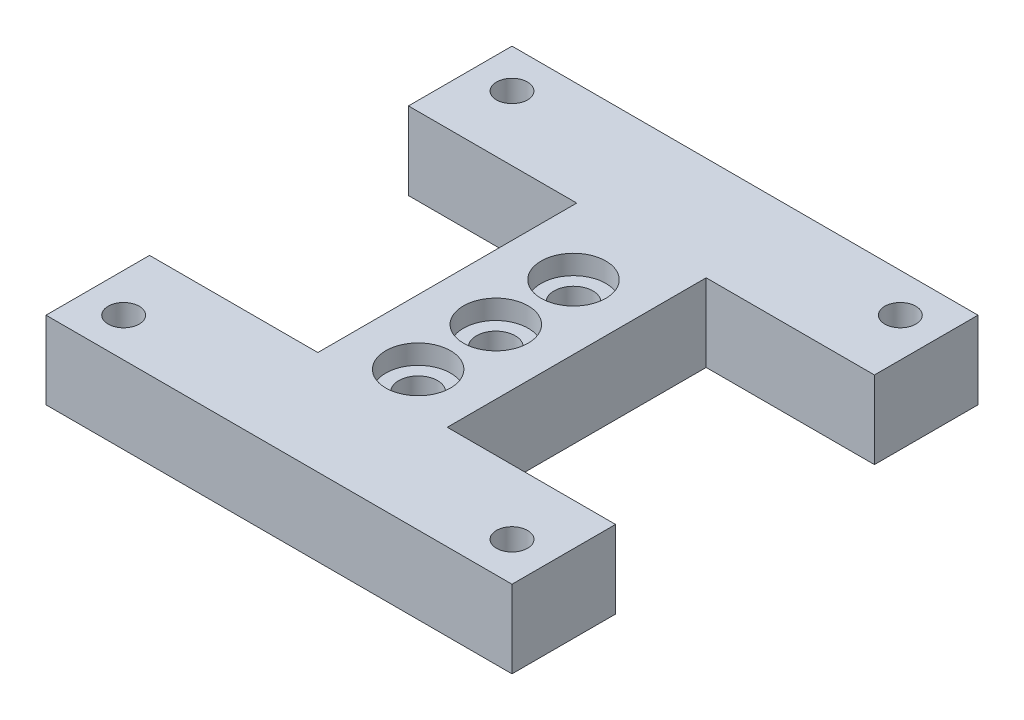
ISO-10303-21;
HEADER;
FILE_DESCRIPTION(('STEP AP214'),'2;1');
FILE_NAME('part.step','',(''),(''),'','','');
FILE_SCHEMA(('AUTOMOTIVE_DESIGN { 1 0 10303 214 1 1 1 1 }'));
ENDSEC;
DATA;
#1=APPLICATION_CONTEXT('core data for automotive mechanical design processes');
#2=APPLICATION_PROTOCOL_DEFINITION('international standard','automotive_design',2000,#1);
#3=PRODUCT_CONTEXT('',#1,'mechanical');
#4=PRODUCT('Part','Part','',(#3));
#5=PRODUCT_RELATED_PRODUCT_CATEGORY('part','',(#4));
#6=PRODUCT_DEFINITION_FORMATION('','',#4);
#7=PRODUCT_DEFINITION_CONTEXT('part definition',#1,'design');
#8=PRODUCT_DEFINITION('design','',#6,#7);
#9=PRODUCT_DEFINITION_SHAPE('','',#8);
#10=(LENGTH_UNIT() NAMED_UNIT(*) SI_UNIT(.MILLI.,.METRE.));
#11=(NAMED_UNIT(*) PLANE_ANGLE_UNIT() SI_UNIT($,.RADIAN.));
#12=(NAMED_UNIT(*) SI_UNIT($,.STERADIAN.) SOLID_ANGLE_UNIT());
#13=UNCERTAINTY_MEASURE_WITH_UNIT(LENGTH_MEASURE(1.E-05),#10,'distance_accuracy_value','');
#14=(GEOMETRIC_REPRESENTATION_CONTEXT(3) GLOBAL_UNCERTAINTY_ASSIGNED_CONTEXT((#13)) GLOBAL_UNIT_ASSIGNED_CONTEXT((#10,
#11,#12)) REPRESENTATION_CONTEXT('',''));
#15=CARTESIAN_POINT('',(0.,0.,0.));
#16=DIRECTION('',(0.,0.,1.));
#17=DIRECTION('',(1.,0.,0.));
#18=AXIS2_PLACEMENT_3D('',#15,#16,#17);
#19=CARTESIAN_POINT('',(-15.,0.,-15.));
#20=DIRECTION('',(0.,1.,0.));
#21=DIRECTION('',(0.,0.,1.));
#22=AXIS2_PLACEMENT_3D('',#19,#20,#21);
#23=CYLINDRICAL_SURFACE('',#22,1.2);
#24=CARTESIAN_POINT('',(-15.,6.,-15.));
#25=DIRECTION('',(0.,1.,0.));
#26=DIRECTION('',(0.,0.,1.));
#27=AXIS2_PLACEMENT_3D('',#24,#25,#26);
#28=CIRCLE('',#27,1.2);
#29=CARTESIAN_POINT('',(-15.,6.,-13.8));
#30=VERTEX_POINT('',#29);
#31=EDGE_CURVE('E160',#30,#30,#28,.T.);
#32=ORIENTED_EDGE('',*,*,#31,.T.);
#33=EDGE_LOOP('',(#32));
#34=FACE_BOUND('',#33,.T.);
#35=CARTESIAN_POINT('',(-15.,2.,-15.));
#36=DIRECTION('',(0.,-1.,0.));
#37=DIRECTION('',(0.,0.,-1.));
#38=AXIS2_PLACEMENT_3D('',#35,#36,#37);
#39=CIRCLE('',#38,1.2);
#40=CARTESIAN_POINT('',(-15.,2.,-16.2));
#41=VERTEX_POINT('',#40);
#42=EDGE_CURVE('E37',#41,#41,#39,.F.);
#43=ORIENTED_EDGE('',*,*,#42,.F.);
#44=EDGE_LOOP('',(#43));
#45=FACE_BOUND('',#44,.T.);
#46=ADVANCED_FACE('F33',(#34,#45),#23,.F.);
#47=CARTESIAN_POINT('',(15.,0.,-15.));
#48=DIRECTION('',(0.,1.,0.));
#49=DIRECTION('',(0.,0.,1.));
#50=AXIS2_PLACEMENT_3D('',#47,#48,#49);
#51=CYLINDRICAL_SURFACE('',#50,1.2);
#52=CARTESIAN_POINT('',(15.,6.,-15.));
#53=DIRECTION('',(0.,1.,0.));
#54=DIRECTION('',(0.,0.,-1.));
#55=AXIS2_PLACEMENT_3D('',#52,#53,#54);
#56=CIRCLE('',#55,1.2);
#57=CARTESIAN_POINT('',(15.,6.,-16.2));
#58=VERTEX_POINT('',#57);
#59=EDGE_CURVE('E272',#58,#58,#56,.T.);
#60=ORIENTED_EDGE('',*,*,#59,.T.);
#61=EDGE_LOOP('',(#60));
#62=FACE_BOUND('',#61,.T.);
#63=CARTESIAN_POINT('',(15.,2.,-15.));
#64=DIRECTION('',(0.,-1.,0.));
#65=DIRECTION('',(0.,0.,-1.));
#66=AXIS2_PLACEMENT_3D('',#63,#64,#65);
#67=CIRCLE('',#66,1.2);
#68=CARTESIAN_POINT('',(15.,2.,-16.2));
#69=VERTEX_POINT('',#68);
#70=EDGE_CURVE('E227',#69,#69,#67,.F.);
#71=ORIENTED_EDGE('',*,*,#70,.F.);
#72=EDGE_LOOP('',(#71));
#73=FACE_BOUND('',#72,.T.);
#74=ADVANCED_FACE('F325',(#62,#73),#51,.F.);
#75=CARTESIAN_POINT('',(15.,0.,15.));
#76=DIRECTION('',(0.,1.,0.));
#77=DIRECTION('',(0.,0.,1.));
#78=AXIS2_PLACEMENT_3D('',#75,#76,#77);
#79=CYLINDRICAL_SURFACE('',#78,1.2);
#80=CARTESIAN_POINT('',(15.,6.,15.));
#81=DIRECTION('',(0.,1.,0.));
#82=DIRECTION('',(0.,0.,1.));
#83=AXIS2_PLACEMENT_3D('',#80,#81,#82);
#84=CIRCLE('',#83,1.2);
#85=CARTESIAN_POINT('',(15.,6.,16.2));
#86=VERTEX_POINT('',#85);
#87=EDGE_CURVE('E275',#86,#86,#84,.T.);
#88=ORIENTED_EDGE('',*,*,#87,.T.);
#89=EDGE_LOOP('',(#88));
#90=FACE_BOUND('',#89,.T.);
#91=CARTESIAN_POINT('',(15.,2.,15.));
#92=DIRECTION('',(0.,-1.,0.));
#93=DIRECTION('',(0.,0.,-1.));
#94=AXIS2_PLACEMENT_3D('',#91,#92,#93);
#95=CIRCLE('',#94,1.2);
#96=CARTESIAN_POINT('',(15.,2.,13.8));
#97=VERTEX_POINT('',#96);
#98=EDGE_CURVE('E223',#97,#97,#95,.F.);
#99=ORIENTED_EDGE('',*,*,#98,.F.);
#100=EDGE_LOOP('',(#99));
#101=FACE_BOUND('',#100,.T.);
#102=ADVANCED_FACE('F331',(#90,#101),#79,.F.);
#103=CARTESIAN_POINT('',(-15.,0.,15.));
#104=DIRECTION('',(0.,1.,0.));
#105=DIRECTION('',(0.,0.,1.));
#106=AXIS2_PLACEMENT_3D('',#103,#104,#105);
#107=CYLINDRICAL_SURFACE('',#106,1.2);
#108=CARTESIAN_POINT('',(-15.,6.,15.));
#109=DIRECTION('',(0.,1.,0.));
#110=DIRECTION('',(0.,0.,-1.));
#111=AXIS2_PLACEMENT_3D('',#108,#109,#110);
#112=CIRCLE('',#111,1.2);
#113=CARTESIAN_POINT('',(-15.,6.,13.8));
#114=VERTEX_POINT('',#113);
#115=EDGE_CURVE('E278',#114,#114,#112,.T.);
#116=ORIENTED_EDGE('',*,*,#115,.T.);
#117=EDGE_LOOP('',(#116));
#118=FACE_BOUND('',#117,.T.);
#119=CARTESIAN_POINT('',(-15.,2.,15.));
#120=DIRECTION('',(0.,-1.,0.));
#121=DIRECTION('',(0.,0.,-1.));
#122=AXIS2_PLACEMENT_3D('',#119,#120,#121);
#123=CIRCLE('',#122,1.2);
#124=CARTESIAN_POINT('',(-15.,2.,13.8));
#125=VERTEX_POINT('',#124);
#126=EDGE_CURVE('E218',#125,#125,#123,.F.);
#127=ORIENTED_EDGE('',*,*,#126,.F.);
#128=EDGE_LOOP('',(#127));
#129=FACE_BOUND('',#128,.T.);
#130=ADVANCED_FACE('F336',(#118,#129),#107,.F.);
#131=CARTESIAN_POINT('',(0.,0.,7.25));
#132=DIRECTION('',(0.,1.,0.));
#133=DIRECTION('',(0.,0.,1.));
#134=AXIS2_PLACEMENT_3D('',#131,#132,#133);
#135=CYLINDRICAL_SURFACE('',#134,1.5);
#136=CARTESIAN_POINT('',(0.,0.,7.25));
#137=DIRECTION('',(0.,1.,0.));
#138=DIRECTION('',(0.,0.,1.));
#139=AXIS2_PLACEMENT_3D('',#136,#137,#138);
#140=CIRCLE('',#139,1.5);
#141=CARTESIAN_POINT('',(0.,0.,8.75));
#142=VERTEX_POINT('',#141);
#143=EDGE_CURVE('E206',#142,#142,#140,.T.);
#144=ORIENTED_EDGE('',*,*,#143,.F.);
#145=EDGE_LOOP('',(#144));
#146=FACE_BOUND('',#145,.T.);
#147=CARTESIAN_POINT('',(0.,4.5,7.25));
#148=DIRECTION('',(0.,1.,0.));
#149=DIRECTION('',(0.,0.,1.));
#150=AXIS2_PLACEMENT_3D('',#147,#148,#149);
#151=CIRCLE('',#150,1.5);
#152=CARTESIAN_POINT('',(0.,4.5,8.75));
#153=VERTEX_POINT('',#152);
#154=EDGE_CURVE('E213',#153,#153,#151,.F.);
#155=ORIENTED_EDGE('',*,*,#154,.F.);
#156=EDGE_LOOP('',(#155));
#157=FACE_BOUND('',#156,.T.);
#158=ADVANCED_FACE('F366',(#146,#157),#135,.F.);
#159=CARTESIAN_POINT('',(0.,0.,1.25));
#160=DIRECTION('',(0.,1.,0.));
#161=DIRECTION('',(0.,0.,1.));
#162=AXIS2_PLACEMENT_3D('',#159,#160,#161);
#163=CYLINDRICAL_SURFACE('',#162,1.5);
#164=CARTESIAN_POINT('',(0.,0.,1.25));
#165=DIRECTION('',(0.,1.,0.));
#166=DIRECTION('',(0.,0.,1.));
#167=AXIS2_PLACEMENT_3D('',#164,#165,#166);
#168=CIRCLE('',#167,1.5);
#169=CARTESIAN_POINT('',(0.,0.,2.75));
#170=VERTEX_POINT('',#169);
#171=EDGE_CURVE('E269',#170,#170,#168,.T.);
#172=ORIENTED_EDGE('',*,*,#171,.F.);
#173=EDGE_LOOP('',(#172));
#174=FACE_BOUND('',#173,.T.);
#175=CARTESIAN_POINT('',(0.,4.5,1.25));
#176=DIRECTION('',(0.,1.,0.));
#177=DIRECTION('',(0.,0.,1.));
#178=AXIS2_PLACEMENT_3D('',#175,#176,#177);
#179=CIRCLE('',#178,1.5);
#180=CARTESIAN_POINT('',(0.,4.5,2.75));
#181=VERTEX_POINT('',#180);
#182=EDGE_CURVE('E208',#181,#181,#179,.F.);
#183=ORIENTED_EDGE('',*,*,#182,.F.);
#184=EDGE_LOOP('',(#183));
#185=FACE_BOUND('',#184,.T.);
#186=ADVANCED_FACE('F362',(#174,#185),#163,.F.);
#187=CARTESIAN_POINT('',(0.,0.,-4.75));
#188=DIRECTION('',(0.,1.,0.));
#189=DIRECTION('',(0.,0.,1.));
#190=AXIS2_PLACEMENT_3D('',#187,#188,#189);
#191=CYLINDRICAL_SURFACE('',#190,1.5);
#192=CARTESIAN_POINT('',(0.,0.,-4.75));
#193=DIRECTION('',(0.,1.,0.));
#194=DIRECTION('',(0.,0.,1.));
#195=AXIS2_PLACEMENT_3D('',#192,#193,#194);
#196=CIRCLE('',#195,1.5);
#197=CARTESIAN_POINT('',(0.,0.,-3.25));
#198=VERTEX_POINT('',#197);
#199=EDGE_CURVE('E266',#198,#198,#196,.T.);
#200=ORIENTED_EDGE('',*,*,#199,.F.);
#201=EDGE_LOOP('',(#200));
#202=FACE_BOUND('',#201,.T.);
#203=CARTESIAN_POINT('',(0.,4.5,-4.75));
#204=DIRECTION('',(0.,1.,0.));
#205=DIRECTION('',(0.,0.,1.));
#206=AXIS2_PLACEMENT_3D('',#203,#204,#205);
#207=CIRCLE('',#206,1.5);
#208=CARTESIAN_POINT('',(0.,4.5,-3.25));
#209=VERTEX_POINT('',#208);
#210=EDGE_CURVE('E203',#209,#209,#207,.F.);
#211=ORIENTED_EDGE('',*,*,#210,.F.);
#212=EDGE_LOOP('',(#211));
#213=FACE_BOUND('',#212,.T.);
#214=ADVANCED_FACE('F365',(#202,#213),#191,.F.);
#215=CARTESIAN_POINT('',(5.,6.,10.));
#216=DIRECTION('',(0.,0.,1.));
#217=DIRECTION('',(1.,0.,0.));
#218=AXIS2_PLACEMENT_3D('',#215,#216,#217);
#219=PLANE('',#218);
#220=DIRECTION('',(-1.,0.,0.));
#221=VECTOR('',#220,1.);
#222=CARTESIAN_POINT('',(5.,0.,10.));
#223=LINE('',#222,#221);
#224=CARTESIAN_POINT('',(18.,0.,10.));
#225=VERTEX_POINT('',#224);
#226=CARTESIAN_POINT('',(5.,0.,10.));
#227=VERTEX_POINT('',#226);
#228=EDGE_CURVE('E156',#225,#227,#223,.T.);
#229=ORIENTED_EDGE('',*,*,#228,.T.);
#230=DIRECTION('',(0.,-1.,0.));
#231=VECTOR('',#230,1.);
#232=CARTESIAN_POINT('',(5.,6.,10.));
#233=LINE('',#232,#231);
#234=CARTESIAN_POINT('',(5.,6.,10.));
#235=VERTEX_POINT('',#234);
#236=EDGE_CURVE('E11',#235,#227,#233,.T.);
#237=ORIENTED_EDGE('',*,*,#236,.F.);
#238=DIRECTION('',(-1.,0.,0.));
#239=VECTOR('',#238,1.);
#240=CARTESIAN_POINT('',(5.,6.,10.));
#241=LINE('',#240,#239);
#242=CARTESIAN_POINT('',(18.,6.,10.));
#243=VERTEX_POINT('',#242);
#244=EDGE_CURVE('E179',#243,#235,#241,.T.);
#245=ORIENTED_EDGE('',*,*,#244,.F.);
#246=DIRECTION('',(0.,-1.,0.));
#247=VECTOR('',#246,1.);
#248=CARTESIAN_POINT('',(18.,6.,10.));
#249=LINE('',#248,#247);
#250=EDGE_CURVE('E152',#243,#225,#249,.T.);
#251=ORIENTED_EDGE('',*,*,#250,.T.);
#252=EDGE_LOOP('',(#229,#237,#245,#251));
#253=FACE_BOUND('',#252,.T.);
#254=ADVANCED_FACE('F35',(#253),#219,.F.);
#255=CARTESIAN_POINT('',(5.,6.,-9.99999999999999));
#256=DIRECTION('',(-1.,0.,0.));
#257=DIRECTION('',(0.,0.,1.));
#258=AXIS2_PLACEMENT_3D('',#255,#256,#257);
#259=PLANE('',#258);
#260=DIRECTION('',(0.,0.,-1.));
#261=VECTOR('',#260,1.);
#262=CARTESIAN_POINT('',(5.,0.,-9.99999999999999));
#263=LINE('',#262,#261);
#264=CARTESIAN_POINT('',(5.,0.,-9.99999999999999));
#265=VERTEX_POINT('',#264);
#266=EDGE_CURVE('E159',#227,#265,#263,.T.);
#267=ORIENTED_EDGE('',*,*,#266,.T.);
#268=DIRECTION('',(0.,-1.,0.));
#269=VECTOR('',#268,1.);
#270=CARTESIAN_POINT('',(5.,6.,-9.99999999999999));
#271=LINE('',#270,#269);
#272=CARTESIAN_POINT('',(5.,6.,-9.99999999999999));
#273=VERTEX_POINT('',#272);
#274=EDGE_CURVE('E43',#273,#265,#271,.T.);
#275=ORIENTED_EDGE('',*,*,#274,.F.);
#276=DIRECTION('',(0.,0.,-1.));
#277=VECTOR('',#276,1.);
#278=CARTESIAN_POINT('',(5.,6.,-9.99999999999999));
#279=LINE('',#278,#277);
#280=EDGE_CURVE('E107',#235,#273,#279,.T.);
#281=ORIENTED_EDGE('',*,*,#280,.F.);
#282=ORIENTED_EDGE('',*,*,#236,.T.);
#283=EDGE_LOOP('',(#267,#275,#281,#282));
#284=FACE_BOUND('',#283,.T.);
#285=ADVANCED_FACE('F663',(#284),#259,.F.);
#286=CARTESIAN_POINT('',(5.,6.,-9.99999999999999));
#287=DIRECTION('',(0.,0.,-1.));
#288=DIRECTION('',(-1.,0.,0.));
#289=AXIS2_PLACEMENT_3D('',#286,#287,#288);
#290=PLANE('',#289);
#291=DIRECTION('',(1.,0.,0.));
#292=VECTOR('',#291,1.);
#293=CARTESIAN_POINT('',(5.,0.,-9.99999999999999));
#294=LINE('',#293,#292);
#295=CARTESIAN_POINT('',(18.,0.,-9.99999999999999));
#296=VERTEX_POINT('',#295);
#297=EDGE_CURVE('E162',#265,#296,#294,.T.);
#298=ORIENTED_EDGE('',*,*,#297,.T.);
#299=DIRECTION('',(0.,-1.,0.));
#300=VECTOR('',#299,1.);
#301=CARTESIAN_POINT('',(18.,6.,-9.99999999999999));
#302=LINE('',#301,#300);
#303=CARTESIAN_POINT('',(18.,6.,-9.99999999999999));
#304=VERTEX_POINT('',#303);
#305=EDGE_CURVE('E198',#304,#296,#302,.T.);
#306=ORIENTED_EDGE('',*,*,#305,.F.);
#307=DIRECTION('',(1.,0.,0.));
#308=VECTOR('',#307,1.);
#309=CARTESIAN_POINT('',(5.,6.,-9.99999999999999));
#310=LINE('',#309,#308);
#311=EDGE_CURVE('E285',#273,#304,#310,.T.);
#312=ORIENTED_EDGE('',*,*,#311,.F.);
#313=ORIENTED_EDGE('',*,*,#274,.T.);
#314=EDGE_LOOP('',(#298,#306,#312,#313));
#315=FACE_BOUND('',#314,.T.);
#316=ADVANCED_FACE('F654',(#315),#290,.F.);
#317=CARTESIAN_POINT('',(18.,6.,-18.));
#318=DIRECTION('',(-1.,0.,0.));
#319=DIRECTION('',(0.,0.,1.));
#320=AXIS2_PLACEMENT_3D('',#317,#318,#319);
#321=PLANE('',#320);
#322=DIRECTION('',(0.,0.,-1.));
#323=VECTOR('',#322,1.);
#324=CARTESIAN_POINT('',(18.,0.,-18.));
#325=LINE('',#324,#323);
#326=CARTESIAN_POINT('',(18.,0.,-18.));
#327=VERTEX_POINT('',#326);
#328=EDGE_CURVE('E164',#296,#327,#325,.T.);
#329=ORIENTED_EDGE('',*,*,#328,.T.);
#330=DIRECTION('',(0.,-1.,0.));
#331=VECTOR('',#330,1.);
#332=CARTESIAN_POINT('',(18.,6.,-18.));
#333=LINE('',#332,#331);
#334=CARTESIAN_POINT('',(18.,6.,-18.));
#335=VERTEX_POINT('',#334);
#336=EDGE_CURVE('E195',#335,#327,#333,.T.);
#337=ORIENTED_EDGE('',*,*,#336,.F.);
#338=DIRECTION('',(0.,0.,-1.));
#339=VECTOR('',#338,1.);
#340=CARTESIAN_POINT('',(18.,6.,-18.));
#341=LINE('',#340,#339);
#342=EDGE_CURVE('E287',#304,#335,#341,.T.);
#343=ORIENTED_EDGE('',*,*,#342,.F.);
#344=ORIENTED_EDGE('',*,*,#305,.T.);
#345=EDGE_LOOP('',(#329,#337,#343,#344));
#346=FACE_BOUND('',#345,.T.);
#347=ADVANCED_FACE('F645',(#346),#321,.F.);
#348=CARTESIAN_POINT('',(-18.,6.,-18.));
#349=DIRECTION('',(0.,0.,1.));
#350=DIRECTION('',(1.,0.,0.));
#351=AXIS2_PLACEMENT_3D('',#348,#349,#350);
#352=PLANE('',#351);
#353=DIRECTION('',(-1.,0.,0.));
#354=VECTOR('',#353,1.);
#355=CARTESIAN_POINT('',(-18.,0.,-18.));
#356=LINE('',#355,#354);
#357=CARTESIAN_POINT('',(-18.,0.,-18.));
#358=VERTEX_POINT('',#357);
#359=EDGE_CURVE('E166',#327,#358,#356,.T.);
#360=ORIENTED_EDGE('',*,*,#359,.T.);
#361=DIRECTION('',(0.,-1.,0.));
#362=VECTOR('',#361,1.);
#363=CARTESIAN_POINT('',(-18.,6.,-18.));
#364=LINE('',#363,#362);
#365=CARTESIAN_POINT('',(-18.,6.,-18.));
#366=VERTEX_POINT('',#365);
#367=EDGE_CURVE('E192',#366,#358,#364,.T.);
#368=ORIENTED_EDGE('',*,*,#367,.F.);
#369=DIRECTION('',(-1.,0.,0.));
#370=VECTOR('',#369,1.);
#371=CARTESIAN_POINT('',(-18.,6.,-18.));
#372=LINE('',#371,#370);
#373=EDGE_CURVE('E289',#335,#366,#372,.T.);
#374=ORIENTED_EDGE('',*,*,#373,.F.);
#375=ORIENTED_EDGE('',*,*,#336,.T.);
#376=EDGE_LOOP('',(#360,#368,#374,#375));
#377=FACE_BOUND('',#376,.T.);
#378=ADVANCED_FACE('F636',(#377),#352,.F.);
#379=CARTESIAN_POINT('',(-18.,6.,-18.));
#380=DIRECTION('',(1.,0.,0.));
#381=DIRECTION('',(0.,0.,-1.));
#382=AXIS2_PLACEMENT_3D('',#379,#380,#381);
#383=PLANE('',#382);
#384=DIRECTION('',(0.,0.,1.));
#385=VECTOR('',#384,1.);
#386=CARTESIAN_POINT('',(-18.,0.,-18.));
#387=LINE('',#386,#385);
#388=CARTESIAN_POINT('',(-18.,0.,-9.99999999999999));
#389=VERTEX_POINT('',#388);
#390=EDGE_CURVE('E168',#358,#389,#387,.T.);
#391=ORIENTED_EDGE('',*,*,#390,.T.);
#392=DIRECTION('',(0.,-1.,0.));
#393=VECTOR('',#392,1.);
#394=CARTESIAN_POINT('',(-18.,6.,-9.99999999999999));
#395=LINE('',#394,#393);
#396=CARTESIAN_POINT('',(-18.,6.,-9.99999999999999));
#397=VERTEX_POINT('',#396);
#398=EDGE_CURVE('E189',#397,#389,#395,.T.);
#399=ORIENTED_EDGE('',*,*,#398,.F.);
#400=DIRECTION('',(0.,0.,1.));
#401=VECTOR('',#400,1.);
#402=CARTESIAN_POINT('',(-18.,6.,-18.));
#403=LINE('',#402,#401);
#404=EDGE_CURVE('E291',#366,#397,#403,.T.);
#405=ORIENTED_EDGE('',*,*,#404,.F.);
#406=ORIENTED_EDGE('',*,*,#367,.T.);
#407=EDGE_LOOP('',(#391,#399,#405,#406));
#408=FACE_BOUND('',#407,.T.);
#409=ADVANCED_FACE('F627',(#408),#383,.F.);
#410=CARTESIAN_POINT('',(-18.,6.,-9.99999999999999));
#411=DIRECTION('',(0.,0.,-1.));
#412=DIRECTION('',(-1.,0.,0.));
#413=AXIS2_PLACEMENT_3D('',#410,#411,#412);
#414=PLANE('',#413);
#415=DIRECTION('',(1.,0.,0.));
#416=VECTOR('',#415,1.);
#417=CARTESIAN_POINT('',(-18.,0.,-9.99999999999999));
#418=LINE('',#417,#416);
#419=CARTESIAN_POINT('',(-5.,0.,-9.99999999999999));
#420=VERTEX_POINT('',#419);
#421=EDGE_CURVE('E170',#389,#420,#418,.T.);
#422=ORIENTED_EDGE('',*,*,#421,.T.);
#423=DIRECTION('',(0.,-1.,0.));
#424=VECTOR('',#423,1.);
#425=CARTESIAN_POINT('',(-5.,6.,-9.99999999999999));
#426=LINE('',#425,#424);
#427=CARTESIAN_POINT('',(-5.,6.,-9.99999999999999));
#428=VERTEX_POINT('',#427);
#429=EDGE_CURVE('E186',#428,#420,#426,.T.);
#430=ORIENTED_EDGE('',*,*,#429,.F.);
#431=DIRECTION('',(1.,0.,0.));
#432=VECTOR('',#431,1.);
#433=CARTESIAN_POINT('',(-18.,6.,-9.99999999999999));
#434=LINE('',#433,#432);
#435=EDGE_CURVE('E293',#397,#428,#434,.T.);
#436=ORIENTED_EDGE('',*,*,#435,.F.);
#437=ORIENTED_EDGE('',*,*,#398,.T.);
#438=EDGE_LOOP('',(#422,#430,#436,#437));
#439=FACE_BOUND('',#438,.T.);
#440=ADVANCED_FACE('F619',(#439),#414,.F.);
#441=CARTESIAN_POINT('',(-5.,6.,-9.99999999999999));
#442=DIRECTION('',(1.,0.,0.));
#443=DIRECTION('',(0.,0.,-1.));
#444=AXIS2_PLACEMENT_3D('',#441,#442,#443);
#445=PLANE('',#444);
#446=DIRECTION('',(0.,0.,1.));
#447=VECTOR('',#446,1.);
#448=CARTESIAN_POINT('',(-5.,0.,-9.99999999999999));
#449=LINE('',#448,#447);
#450=CARTESIAN_POINT('',(-5.,0.,9.99999999999999));
#451=VERTEX_POINT('',#450);
#452=EDGE_CURVE('E172',#420,#451,#449,.T.);
#453=ORIENTED_EDGE('',*,*,#452,.T.);
#454=DIRECTION('',(0.,-1.,0.));
#455=VECTOR('',#454,1.);
#456=CARTESIAN_POINT('',(-5.,6.,9.99999999999999));
#457=LINE('',#456,#455);
#458=CARTESIAN_POINT('',(-5.,6.,9.99999999999999));
#459=VERTEX_POINT('',#458);
#460=EDGE_CURVE('E183',#459,#451,#457,.T.);
#461=ORIENTED_EDGE('',*,*,#460,.F.);
#462=DIRECTION('',(0.,0.,1.));
#463=VECTOR('',#462,1.);
#464=CARTESIAN_POINT('',(-5.,6.,-9.99999999999999));
#465=LINE('',#464,#463);
#466=EDGE_CURVE('E295',#428,#459,#465,.T.);
#467=ORIENTED_EDGE('',*,*,#466,.F.);
#468=ORIENTED_EDGE('',*,*,#429,.T.);
#469=EDGE_LOOP('',(#453,#461,#467,#468));
#470=FACE_BOUND('',#469,.T.);
#471=ADVANCED_FACE('F301',(#470),#445,.F.);
#472=CARTESIAN_POINT('',(-18.,6.,10.));
#473=DIRECTION('',(0.,0.,1.));
#474=DIRECTION('',(1.,0.,0.));
#475=AXIS2_PLACEMENT_3D('',#472,#473,#474);
#476=PLANE('',#475);
#477=DIRECTION('',(-1.,0.,0.));
#478=VECTOR('',#477,1.);
#479=CARTESIAN_POINT('',(-18.,0.,10.));
#480=LINE('',#479,#478);
#481=CARTESIAN_POINT('',(-18.,0.,10.));
#482=VERTEX_POINT('',#481);
#483=EDGE_CURVE('E174',#451,#482,#480,.T.);
#484=ORIENTED_EDGE('',*,*,#483,.T.);
#485=DIRECTION('',(0.,-1.,0.));
#486=VECTOR('',#485,1.);
#487=CARTESIAN_POINT('',(-18.,6.,10.));
#488=LINE('',#487,#486);
#489=CARTESIAN_POINT('',(-18.,6.,10.));
#490=VERTEX_POINT('',#489);
#491=EDGE_CURVE('E147',#490,#482,#488,.T.);
#492=ORIENTED_EDGE('',*,*,#491,.F.);
#493=DIRECTION('',(-1.,0.,0.));
#494=VECTOR('',#493,1.);
#495=CARTESIAN_POINT('',(-18.,6.,10.));
#496=LINE('',#495,#494);
#497=EDGE_CURVE('E138',#459,#490,#496,.T.);
#498=ORIENTED_EDGE('',*,*,#497,.F.);
#499=ORIENTED_EDGE('',*,*,#460,.T.);
#500=EDGE_LOOP('',(#484,#492,#498,#499));
#501=FACE_BOUND('',#500,.T.);
#502=ADVANCED_FACE('F305',(#501),#476,.F.);
#503=CARTESIAN_POINT('',(-18.,6.,18.));
#504=DIRECTION('',(1.,0.,0.));
#505=DIRECTION('',(0.,0.,-1.));
#506=AXIS2_PLACEMENT_3D('',#503,#504,#505);
#507=PLANE('',#506);
#508=DIRECTION('',(0.,0.,1.));
#509=VECTOR('',#508,1.);
#510=CARTESIAN_POINT('',(-18.,0.,18.));
#511=LINE('',#510,#509);
#512=CARTESIAN_POINT('',(-18.,0.,18.));
#513=VERTEX_POINT('',#512);
#514=EDGE_CURVE('E146',#482,#513,#511,.T.);
#515=ORIENTED_EDGE('',*,*,#514,.T.);
#516=DIRECTION('',(0.,-1.,0.));
#517=VECTOR('',#516,1.);
#518=CARTESIAN_POINT('',(-18.,6.,18.));
#519=LINE('',#518,#517);
#520=CARTESIAN_POINT('',(-18.,6.,18.));
#521=VERTEX_POINT('',#520);
#522=EDGE_CURVE('E143',#521,#513,#519,.T.);
#523=ORIENTED_EDGE('',*,*,#522,.F.);
#524=DIRECTION('',(0.,0.,1.));
#525=VECTOR('',#524,1.);
#526=CARTESIAN_POINT('',(-18.,6.,18.));
#527=LINE('',#526,#525);
#528=EDGE_CURVE('E132',#490,#521,#527,.T.);
#529=ORIENTED_EDGE('',*,*,#528,.F.);
#530=ORIENTED_EDGE('',*,*,#491,.T.);
#531=EDGE_LOOP('',(#515,#523,#529,#530));
#532=FACE_BOUND('',#531,.T.);
#533=ADVANCED_FACE('F144',(#532),#507,.F.);
#534=CARTESIAN_POINT('',(-18.,6.,18.));
#535=DIRECTION('',(0.,0.,-1.));
#536=DIRECTION('',(-1.,0.,0.));
#537=AXIS2_PLACEMENT_3D('',#534,#535,#536);
#538=PLANE('',#537);
#539=DIRECTION('',(1.,0.,0.));
#540=VECTOR('',#539,1.);
#541=CARTESIAN_POINT('',(-18.,0.,18.));
#542=LINE('',#541,#540);
#543=CARTESIAN_POINT('',(18.,0.,18.));
#544=VERTEX_POINT('',#543);
#545=EDGE_CURVE('E93',#513,#544,#542,.T.);
#546=ORIENTED_EDGE('',*,*,#545,.T.);
#547=DIRECTION('',(0.,-1.,0.));
#548=VECTOR('',#547,1.);
#549=CARTESIAN_POINT('',(18.,6.,18.));
#550=LINE('',#549,#548);
#551=CARTESIAN_POINT('',(18.,6.,18.));
#552=VERTEX_POINT('',#551);
#553=EDGE_CURVE('E148',#552,#544,#550,.T.);
#554=ORIENTED_EDGE('',*,*,#553,.F.);
#555=DIRECTION('',(1.,0.,0.));
#556=VECTOR('',#555,1.);
#557=CARTESIAN_POINT('',(-18.,6.,18.));
#558=LINE('',#557,#556);
#559=EDGE_CURVE('E136',#521,#552,#558,.T.);
#560=ORIENTED_EDGE('',*,*,#559,.F.);
#561=ORIENTED_EDGE('',*,*,#522,.T.);
#562=EDGE_LOOP('',(#546,#554,#560,#561));
#563=FACE_BOUND('',#562,.T.);
#564=ADVANCED_FACE('F150',(#563),#538,.F.);
#565=CARTESIAN_POINT('',(18.,6.,18.));
#566=DIRECTION('',(-1.,0.,0.));
#567=DIRECTION('',(0.,0.,1.));
#568=AXIS2_PLACEMENT_3D('',#565,#566,#567);
#569=PLANE('',#568);
#570=DIRECTION('',(0.,0.,-1.));
#571=VECTOR('',#570,1.);
#572=CARTESIAN_POINT('',(18.,0.,18.));
#573=LINE('',#572,#571);
#574=EDGE_CURVE('E99',#544,#225,#573,.T.);
#575=ORIENTED_EDGE('',*,*,#574,.T.);
#576=ORIENTED_EDGE('',*,*,#250,.F.);
#577=DIRECTION('',(0.,0.,-1.));
#578=VECTOR('',#577,1.);
#579=CARTESIAN_POINT('',(18.,6.,18.));
#580=LINE('',#579,#578);
#581=EDGE_CURVE('E52',#552,#243,#580,.T.);
#582=ORIENTED_EDGE('',*,*,#581,.F.);
#583=ORIENTED_EDGE('',*,*,#553,.T.);
#584=EDGE_LOOP('',(#575,#576,#582,#583));
#585=FACE_BOUND('',#584,.T.);
#586=ADVANCED_FACE('F313',(#585),#569,.F.);
#587=CARTESIAN_POINT('',(0.,6.,0.));
#588=DIRECTION('',(0.,1.,0.));
#589=DIRECTION('',(0.,0.,1.));
#590=AXIS2_PLACEMENT_3D('',#587,#588,#589);
#591=PLANE('',#590);
#592=CARTESIAN_POINT('',(0.,6.,7.25));
#593=DIRECTION('',(0.,1.,0.));
#594=DIRECTION('',(0.,0.,1.));
#595=AXIS2_PLACEMENT_3D('',#592,#593,#594);
#596=CIRCLE('',#595,2.5);
#597=CARTESIAN_POINT('',(0.,6.,9.75));
#598=VERTEX_POINT('',#597);
#599=EDGE_CURVE('E221',#598,#598,#596,.T.);
#600=ORIENTED_EDGE('',*,*,#599,.F.);
#601=EDGE_LOOP('',(#600));
#602=FACE_BOUND('',#601,.T.);
#603=CARTESIAN_POINT('',(0.,6.,1.25));
#604=DIRECTION('',(0.,1.,0.));
#605=DIRECTION('',(0.,0.,1.));
#606=AXIS2_PLACEMENT_3D('',#603,#604,#605);
#607=CIRCLE('',#606,2.5);
#608=CARTESIAN_POINT('',(0.,6.,3.75));
#609=VERTEX_POINT('',#608);
#610=EDGE_CURVE('E216',#609,#609,#607,.T.);
#611=ORIENTED_EDGE('',*,*,#610,.F.);
#612=EDGE_LOOP('',(#611));
#613=FACE_BOUND('',#612,.T.);
#614=CARTESIAN_POINT('',(0.,6.,-4.75));
#615=DIRECTION('',(0.,1.,0.));
#616=DIRECTION('',(0.,0.,1.));
#617=AXIS2_PLACEMENT_3D('',#614,#615,#616);
#618=CIRCLE('',#617,2.5);
#619=CARTESIAN_POINT('',(0.,6.,-2.25));
#620=VERTEX_POINT('',#619);
#621=EDGE_CURVE('E211',#620,#620,#618,.T.);
#622=ORIENTED_EDGE('',*,*,#621,.F.);
#623=EDGE_LOOP('',(#622));
#624=FACE_BOUND('',#623,.T.);
#625=ORIENTED_EDGE('',*,*,#59,.F.);
#626=EDGE_LOOP('',(#625));
#627=FACE_BOUND('',#626,.T.);
#628=ORIENTED_EDGE('',*,*,#87,.F.);
#629=EDGE_LOOP('',(#628));
#630=FACE_BOUND('',#629,.T.);
#631=ORIENTED_EDGE('',*,*,#115,.F.);
#632=EDGE_LOOP('',(#631));
#633=FACE_BOUND('',#632,.T.);
#634=ORIENTED_EDGE('',*,*,#31,.F.);
#635=EDGE_LOOP('',(#634));
#636=FACE_BOUND('',#635,.T.);
#637=ORIENTED_EDGE('',*,*,#244,.T.);
#638=ORIENTED_EDGE('',*,*,#280,.T.);
#639=ORIENTED_EDGE('',*,*,#311,.T.);
#640=ORIENTED_EDGE('',*,*,#342,.T.);
#641=ORIENTED_EDGE('',*,*,#373,.T.);
#642=ORIENTED_EDGE('',*,*,#404,.T.);
#643=ORIENTED_EDGE('',*,*,#435,.T.);
#644=ORIENTED_EDGE('',*,*,#466,.T.);
#645=ORIENTED_EDGE('',*,*,#497,.T.);
#646=ORIENTED_EDGE('',*,*,#528,.T.);
#647=ORIENTED_EDGE('',*,*,#559,.T.);
#648=ORIENTED_EDGE('',*,*,#581,.T.);
#649=EDGE_LOOP('',(#637,#638,#639,#640,#641,#642,#643,#644,#645,#646,#647,#648));
#650=FACE_BOUND('',#649,.T.);
#651=ADVANCED_FACE('F134',(#602,#613,#624,#627,#630,#633,#636,#650),#591,.T.);
#652=CARTESIAN_POINT('',(0.,0.,0.));
#653=DIRECTION('',(0.,1.,0.));
#654=DIRECTION('',(0.,0.,1.));
#655=AXIS2_PLACEMENT_3D('',#652,#653,#654);
#656=PLANE('',#655);
#657=CARTESIAN_POINT('',(-15.,0.,-15.));
#658=DIRECTION('',(0.,-1.,0.));
#659=DIRECTION('',(0.,0.,-1.));
#660=AXIS2_PLACEMENT_3D('',#657,#658,#659);
#661=CIRCLE('',#660,2.2);
#662=CARTESIAN_POINT('',(-15.,0.,-17.2));
#663=VERTEX_POINT('',#662);
#664=EDGE_CURVE('E243',#663,#663,#661,.T.);
#665=ORIENTED_EDGE('',*,*,#664,.F.);
#666=EDGE_LOOP('',(#665));
#667=FACE_BOUND('',#666,.T.);
#668=CARTESIAN_POINT('',(15.,0.,-15.));
#669=DIRECTION('',(0.,-1.,0.));
#670=DIRECTION('',(0.,0.,-1.));
#671=AXIS2_PLACEMENT_3D('',#668,#669,#670);
#672=CIRCLE('',#671,2.2);
#673=CARTESIAN_POINT('',(15.,0.,-17.2));
#674=VERTEX_POINT('',#673);
#675=EDGE_CURVE('E236',#674,#674,#672,.T.);
#676=ORIENTED_EDGE('',*,*,#675,.F.);
#677=EDGE_LOOP('',(#676));
#678=FACE_BOUND('',#677,.T.);
#679=CARTESIAN_POINT('',(15.,0.,15.));
#680=DIRECTION('',(0.,-1.,0.));
#681=DIRECTION('',(0.,0.,-1.));
#682=AXIS2_PLACEMENT_3D('',#679,#680,#681);
#683=CIRCLE('',#682,2.2);
#684=CARTESIAN_POINT('',(15.,0.,12.8));
#685=VERTEX_POINT('',#684);
#686=EDGE_CURVE('E229',#685,#685,#683,.T.);
#687=ORIENTED_EDGE('',*,*,#686,.F.);
#688=EDGE_LOOP('',(#687));
#689=FACE_BOUND('',#688,.T.);
#690=CARTESIAN_POINT('',(-15.,0.,15.));
#691=DIRECTION('',(0.,-1.,0.));
#692=DIRECTION('',(0.,0.,-1.));
#693=AXIS2_PLACEMENT_3D('',#690,#691,#692);
#694=CIRCLE('',#693,2.2);
#695=CARTESIAN_POINT('',(-15.,0.,12.8));
#696=VERTEX_POINT('',#695);
#697=EDGE_CURVE('E225',#696,#696,#694,.T.);
#698=ORIENTED_EDGE('',*,*,#697,.F.);
#699=EDGE_LOOP('',(#698));
#700=FACE_BOUND('',#699,.T.);
#701=ORIENTED_EDGE('',*,*,#143,.T.);
#702=EDGE_LOOP('',(#701));
#703=FACE_BOUND('',#702,.T.);
#704=ORIENTED_EDGE('',*,*,#199,.T.);
#705=EDGE_LOOP('',(#704));
#706=FACE_BOUND('',#705,.T.);
#707=ORIENTED_EDGE('',*,*,#171,.T.);
#708=EDGE_LOOP('',(#707));
#709=FACE_BOUND('',#708,.T.);
#710=ORIENTED_EDGE('',*,*,#228,.F.);
#711=ORIENTED_EDGE('',*,*,#574,.F.);
#712=ORIENTED_EDGE('',*,*,#545,.F.);
#713=ORIENTED_EDGE('',*,*,#514,.F.);
#714=ORIENTED_EDGE('',*,*,#483,.F.);
#715=ORIENTED_EDGE('',*,*,#452,.F.);
#716=ORIENTED_EDGE('',*,*,#421,.F.);
#717=ORIENTED_EDGE('',*,*,#390,.F.);
#718=ORIENTED_EDGE('',*,*,#359,.F.);
#719=ORIENTED_EDGE('',*,*,#328,.F.);
#720=ORIENTED_EDGE('',*,*,#297,.F.);
#721=ORIENTED_EDGE('',*,*,#266,.F.);
#722=EDGE_LOOP('',(#710,#711,#712,#713,#714,#715,#716,#717,#718,#719,#720,#721));
#723=FACE_BOUND('',#722,.T.);
#724=ADVANCED_FACE('F308',(#667,#678,#689,#700,#703,#706,#709,#723),#656,.F.);
#725=CARTESIAN_POINT('',(0.,4.5,-4.75));
#726=DIRECTION('',(0.,1.,0.));
#727=DIRECTION('',(0.,0.,1.));
#728=AXIS2_PLACEMENT_3D('',#725,#726,#727);
#729=PLANE('',#728);
#730=CARTESIAN_POINT('',(0.,4.5,-4.75));
#731=DIRECTION('',(0.,1.,0.));
#732=DIRECTION('',(0.,0.,1.));
#733=AXIS2_PLACEMENT_3D('',#730,#731,#732);
#734=CIRCLE('',#733,2.5);
#735=CARTESIAN_POINT('',(0.,4.5,-2.25));
#736=VERTEX_POINT('',#735);
#737=EDGE_CURVE('E207',#736,#736,#734,.T.);
#738=ORIENTED_EDGE('',*,*,#737,.T.);
#739=EDGE_LOOP('',(#738));
#740=FACE_BOUND('',#739,.T.);
#741=ORIENTED_EDGE('',*,*,#210,.T.);
#742=EDGE_LOOP('',(#741));
#743=FACE_BOUND('',#742,.T.);
#744=ADVANCED_FACE('F339',(#740,#743),#729,.T.);
#745=CARTESIAN_POINT('',(0.,4.5,-4.75));
#746=DIRECTION('',(0.,1.,0.));
#747=DIRECTION('',(0.,0.,1.));
#748=AXIS2_PLACEMENT_3D('',#745,#746,#747);
#749=CYLINDRICAL_SURFACE('',#748,2.5);
#750=ORIENTED_EDGE('',*,*,#737,.F.);
#751=EDGE_LOOP('',(#750));
#752=FACE_BOUND('',#751,.T.);
#753=ORIENTED_EDGE('',*,*,#621,.T.);
#754=EDGE_LOOP('',(#753));
#755=FACE_BOUND('',#754,.T.);
#756=ADVANCED_FACE('F344',(#752,#755),#749,.F.);
#757=CARTESIAN_POINT('',(0.,4.5,1.25));
#758=DIRECTION('',(0.,1.,0.));
#759=DIRECTION('',(0.,0.,1.));
#760=AXIS2_PLACEMENT_3D('',#757,#758,#759);
#761=PLANE('',#760);
#762=CARTESIAN_POINT('',(0.,4.5,1.25));
#763=DIRECTION('',(0.,1.,0.));
#764=DIRECTION('',(0.,0.,1.));
#765=AXIS2_PLACEMENT_3D('',#762,#763,#764);
#766=CIRCLE('',#765,2.5);
#767=CARTESIAN_POINT('',(0.,4.5,3.75));
#768=VERTEX_POINT('',#767);
#769=EDGE_CURVE('E212',#768,#768,#766,.T.);
#770=ORIENTED_EDGE('',*,*,#769,.T.);
#771=EDGE_LOOP('',(#770));
#772=FACE_BOUND('',#771,.T.);
#773=ORIENTED_EDGE('',*,*,#182,.T.);
#774=EDGE_LOOP('',(#773));
#775=FACE_BOUND('',#774,.T.);
#776=ADVANCED_FACE('F370',(#772,#775),#761,.T.);
#777=CARTESIAN_POINT('',(0.,4.5,1.25));
#778=DIRECTION('',(0.,1.,0.));
#779=DIRECTION('',(0.,0.,1.));
#780=AXIS2_PLACEMENT_3D('',#777,#778,#779);
#781=CYLINDRICAL_SURFACE('',#780,2.5);
#782=ORIENTED_EDGE('',*,*,#769,.F.);
#783=EDGE_LOOP('',(#782));
#784=FACE_BOUND('',#783,.T.);
#785=ORIENTED_EDGE('',*,*,#610,.T.);
#786=EDGE_LOOP('',(#785));
#787=FACE_BOUND('',#786,.T.);
#788=ADVANCED_FACE('F372',(#784,#787),#781,.F.);
#789=CARTESIAN_POINT('',(0.,4.5,7.25));
#790=DIRECTION('',(0.,1.,0.));
#791=DIRECTION('',(0.,0.,1.));
#792=AXIS2_PLACEMENT_3D('',#789,#790,#791);
#793=PLANE('',#792);
#794=CARTESIAN_POINT('',(0.,4.5,7.25));
#795=DIRECTION('',(0.,1.,0.));
#796=DIRECTION('',(0.,0.,1.));
#797=AXIS2_PLACEMENT_3D('',#794,#795,#796);
#798=CIRCLE('',#797,2.5);
#799=CARTESIAN_POINT('',(0.,4.5,9.75));
#800=VERTEX_POINT('',#799);
#801=EDGE_CURVE('E217',#800,#800,#798,.T.);
#802=ORIENTED_EDGE('',*,*,#801,.T.);
#803=EDGE_LOOP('',(#802));
#804=FACE_BOUND('',#803,.T.);
#805=ORIENTED_EDGE('',*,*,#154,.T.);
#806=EDGE_LOOP('',(#805));
#807=FACE_BOUND('',#806,.T.);
#808=ADVANCED_FACE('F379',(#804,#807),#793,.T.);
#809=CARTESIAN_POINT('',(0.,4.5,7.25));
#810=DIRECTION('',(0.,1.,0.));
#811=DIRECTION('',(0.,0.,1.));
#812=AXIS2_PLACEMENT_3D('',#809,#810,#811);
#813=CYLINDRICAL_SURFACE('',#812,2.5);
#814=ORIENTED_EDGE('',*,*,#801,.F.);
#815=EDGE_LOOP('',(#814));
#816=FACE_BOUND('',#815,.T.);
#817=ORIENTED_EDGE('',*,*,#599,.T.);
#818=EDGE_LOOP('',(#817));
#819=FACE_BOUND('',#818,.T.);
#820=ADVANCED_FACE('F385',(#816,#819),#813,.F.);
#821=CARTESIAN_POINT('',(-15.,2.,15.));
#822=DIRECTION('',(0.,-1.,0.));
#823=DIRECTION('',(0.,0.,-1.));
#824=AXIS2_PLACEMENT_3D('',#821,#822,#823);
#825=PLANE('',#824);
#826=CARTESIAN_POINT('',(-15.,2.,15.));
#827=DIRECTION('',(0.,-1.,0.));
#828=DIRECTION('',(0.,0.,-1.));
#829=AXIS2_PLACEMENT_3D('',#826,#827,#828);
#830=CIRCLE('',#829,2.2);
#831=CARTESIAN_POINT('',(-15.,2.,12.8));
#832=VERTEX_POINT('',#831);
#833=EDGE_CURVE('E222',#832,#832,#830,.T.);
#834=ORIENTED_EDGE('',*,*,#833,.T.);
#835=EDGE_LOOP('',(#834));
#836=FACE_BOUND('',#835,.T.);
#837=ORIENTED_EDGE('',*,*,#126,.T.);
#838=EDGE_LOOP('',(#837));
#839=FACE_BOUND('',#838,.T.);
#840=ADVANCED_FACE('F416',(#836,#839),#825,.T.);
#841=CARTESIAN_POINT('',(-15.,2.,15.));
#842=DIRECTION('',(0.,-1.,0.));
#843=DIRECTION('',(0.,0.,-1.));
#844=AXIS2_PLACEMENT_3D('',#841,#842,#843);
#845=CYLINDRICAL_SURFACE('',#844,2.2);
#846=ORIENTED_EDGE('',*,*,#833,.F.);
#847=EDGE_LOOP('',(#846));
#848=FACE_BOUND('',#847,.T.);
#849=ORIENTED_EDGE('',*,*,#697,.T.);
#850=EDGE_LOOP('',(#849));
#851=FACE_BOUND('',#850,.T.);
#852=ADVANCED_FACE('F406',(#848,#851),#845,.F.);
#853=CARTESIAN_POINT('',(15.,2.,15.));
#854=DIRECTION('',(0.,-1.,0.));
#855=DIRECTION('',(0.,0.,-1.));
#856=AXIS2_PLACEMENT_3D('',#853,#854,#855);
#857=PLANE('',#856);
#858=CARTESIAN_POINT('',(15.,2.,15.));
#859=DIRECTION('',(0.,-1.,0.));
#860=DIRECTION('',(0.,0.,-1.));
#861=AXIS2_PLACEMENT_3D('',#858,#859,#860);
#862=CIRCLE('',#861,2.2);
#863=CARTESIAN_POINT('',(15.,2.,12.8));
#864=VERTEX_POINT('',#863);
#865=EDGE_CURVE('E226',#864,#864,#862,.T.);
#866=ORIENTED_EDGE('',*,*,#865,.T.);
#867=EDGE_LOOP('',(#866));
#868=FACE_BOUND('',#867,.T.);
#869=ORIENTED_EDGE('',*,*,#98,.T.);
#870=EDGE_LOOP('',(#869));
#871=FACE_BOUND('',#870,.T.);
#872=ADVANCED_FACE('F403',(#868,#871),#857,.T.);
#873=CARTESIAN_POINT('',(15.,2.,15.));
#874=DIRECTION('',(0.,-1.,0.));
#875=DIRECTION('',(0.,0.,-1.));
#876=AXIS2_PLACEMENT_3D('',#873,#874,#875);
#877=CYLINDRICAL_SURFACE('',#876,2.2);
#878=ORIENTED_EDGE('',*,*,#865,.F.);
#879=EDGE_LOOP('',(#878));
#880=FACE_BOUND('',#879,.T.);
#881=ORIENTED_EDGE('',*,*,#686,.T.);
#882=EDGE_LOOP('',(#881));
#883=FACE_BOUND('',#882,.T.);
#884=ADVANCED_FACE('F405',(#880,#883),#877,.F.);
#885=CARTESIAN_POINT('',(15.,2.,-15.));
#886=DIRECTION('',(0.,-1.,0.));
#887=DIRECTION('',(0.,0.,-1.));
#888=AXIS2_PLACEMENT_3D('',#885,#886,#887);
#889=PLANE('',#888);
#890=CARTESIAN_POINT('',(15.,2.,-15.));
#891=DIRECTION('',(0.,-1.,0.));
#892=DIRECTION('',(0.,0.,-1.));
#893=AXIS2_PLACEMENT_3D('',#890,#891,#892);
#894=CIRCLE('',#893,2.2);
#895=CARTESIAN_POINT('',(15.,2.,-17.2));
#896=VERTEX_POINT('',#895);
#897=EDGE_CURVE('E230',#896,#896,#894,.T.);
#898=ORIENTED_EDGE('',*,*,#897,.T.);
#899=EDGE_LOOP('',(#898));
#900=FACE_BOUND('',#899,.T.);
#901=ORIENTED_EDGE('',*,*,#70,.T.);
#902=EDGE_LOOP('',(#901));
#903=FACE_BOUND('',#902,.T.);
#904=ADVANCED_FACE('F413',(#900,#903),#889,.T.);
#905=CARTESIAN_POINT('',(15.,2.,-15.));
#906=DIRECTION('',(0.,-1.,0.));
#907=DIRECTION('',(0.,0.,-1.));
#908=AXIS2_PLACEMENT_3D('',#905,#906,#907);
#909=CYLINDRICAL_SURFACE('',#908,2.2);
#910=ORIENTED_EDGE('',*,*,#897,.F.);
#911=EDGE_LOOP('',(#910));
#912=FACE_BOUND('',#911,.T.);
#913=ORIENTED_EDGE('',*,*,#675,.T.);
#914=EDGE_LOOP('',(#913));
#915=FACE_BOUND('',#914,.T.);
#916=ADVANCED_FACE('F420',(#912,#915),#909,.F.);
#917=CARTESIAN_POINT('',(-15.,2.,-15.));
#918=DIRECTION('',(0.,-1.,0.));
#919=DIRECTION('',(0.,0.,-1.));
#920=AXIS2_PLACEMENT_3D('',#917,#918,#919);
#921=PLANE('',#920);
#922=CARTESIAN_POINT('',(-15.,2.,-15.));
#923=DIRECTION('',(0.,-1.,0.));
#924=DIRECTION('',(0.,0.,-1.));
#925=AXIS2_PLACEMENT_3D('',#922,#923,#924);
#926=CIRCLE('',#925,2.2);
#927=CARTESIAN_POINT('',(-15.,2.,-17.2));
#928=VERTEX_POINT('',#927);
#929=EDGE_CURVE('E516',#928,#928,#926,.T.);
#930=ORIENTED_EDGE('',*,*,#929,.T.);
#931=EDGE_LOOP('',(#930));
#932=FACE_BOUND('',#931,.T.);
#933=ORIENTED_EDGE('',*,*,#42,.T.);
#934=EDGE_LOOP('',(#933));
#935=FACE_BOUND('',#934,.T.);
#936=ADVANCED_FACE('F490',(#932,#935),#921,.T.);
#937=CARTESIAN_POINT('',(-15.,2.,-15.));
#938=DIRECTION('',(0.,-1.,0.));
#939=DIRECTION('',(0.,0.,-1.));
#940=AXIS2_PLACEMENT_3D('',#937,#938,#939);
#941=CYLINDRICAL_SURFACE('',#940,2.2);
#942=ORIENTED_EDGE('',*,*,#929,.F.);
#943=EDGE_LOOP('',(#942));
#944=FACE_BOUND('',#943,.T.);
#945=ORIENTED_EDGE('',*,*,#664,.T.);
#946=EDGE_LOOP('',(#945));
#947=FACE_BOUND('',#946,.T.);
#948=ADVANCED_FACE('F499',(#944,#947),#941,.F.);
#949=CLOSED_SHELL('',(#46,#74,#102,#130,#158,#186,#214,#254,#285,#316,#347,#378,#409,#440,#471,
#502,#533,#564,#586,#651,#724,#744,#756,#776,#788,#808,#820,#840,#852,#872,#884,#904,#916,#936,#948));
#950=MANIFOLD_SOLID_BREP('B2',#949);
#951=ADVANCED_BREP_SHAPE_REPRESENTATION('',(#18,#950),#14);
#952=SHAPE_DEFINITION_REPRESENTATION(#9,#951);
ENDSEC;
END-ISO-10303-21;
